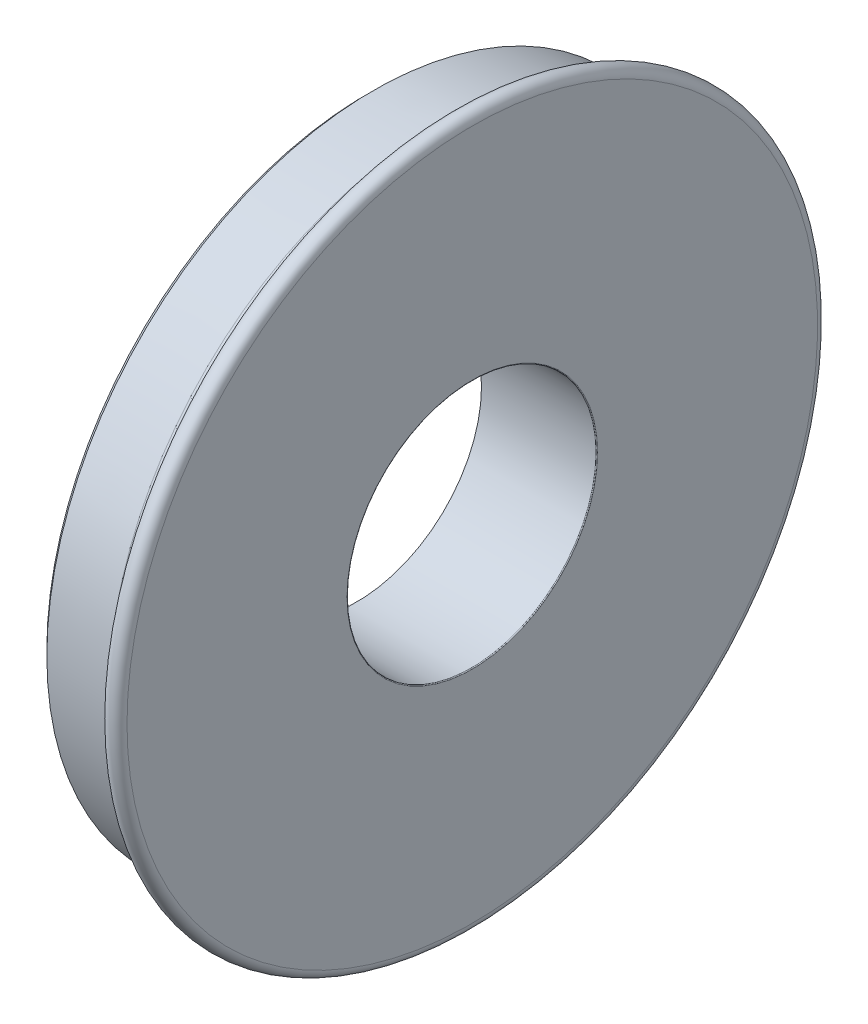
ISO-10303-21;
HEADER;
FILE_DESCRIPTION(('STEP AP214'),'2;1');
FILE_NAME('part.step','',(''),(''),'','','');
FILE_SCHEMA(('AUTOMOTIVE_DESIGN { 1 0 10303 214 1 1 1 1 }'));
ENDSEC;
DATA;
#1=APPLICATION_CONTEXT('core data for automotive mechanical design processes');
#2=APPLICATION_PROTOCOL_DEFINITION('international standard','automotive_design',2000,#1);
#3=PRODUCT_CONTEXT('',#1,'mechanical');
#4=PRODUCT('Part','Part','',(#3));
#5=PRODUCT_RELATED_PRODUCT_CATEGORY('part','',(#4));
#6=PRODUCT_DEFINITION_FORMATION('','',#4);
#7=PRODUCT_DEFINITION_CONTEXT('part definition',#1,'design');
#8=PRODUCT_DEFINITION('design','',#6,#7);
#9=PRODUCT_DEFINITION_SHAPE('','',#8);
#10=(LENGTH_UNIT() NAMED_UNIT(*) SI_UNIT(.MILLI.,.METRE.));
#11=(NAMED_UNIT(*) PLANE_ANGLE_UNIT() SI_UNIT($,.RADIAN.));
#12=(NAMED_UNIT(*) SI_UNIT($,.STERADIAN.) SOLID_ANGLE_UNIT());
#13=UNCERTAINTY_MEASURE_WITH_UNIT(LENGTH_MEASURE(1.E-05),#10,'distance_accuracy_value','');
#14=(GEOMETRIC_REPRESENTATION_CONTEXT(3) GLOBAL_UNCERTAINTY_ASSIGNED_CONTEXT((#13)) GLOBAL_UNIT_ASSIGNED_CONTEXT((#10,
#11,#12)) REPRESENTATION_CONTEXT('',''));
#15=CARTESIAN_POINT('',(0.,0.,0.));
#16=DIRECTION('',(0.,0.,1.));
#17=DIRECTION('',(1.,0.,0.));
#18=AXIS2_PLACEMENT_3D('',#15,#16,#17);
#19=CARTESIAN_POINT('',(0.,49.14,0.));
#20=DIRECTION('',(1.,0.,0.));
#21=DIRECTION('',(0.,0.,-1.));
#22=AXIS2_PLACEMENT_3D('',#19,#20,#21);
#23=PLANE('',#22);
#24=CARTESIAN_POINT('',(0.,0.,0.));
#25=DIRECTION('',(-1.,0.,0.));
#26=DIRECTION('',(0.,0.,1.));
#27=AXIS2_PLACEMENT_3D('',#24,#25,#26);
#28=CIRCLE('',#27,37.8);
#29=CARTESIAN_POINT('',(0.,0.,37.8));
#30=VERTEX_POINT('',#29);
#31=EDGE_CURVE('E10',#30,#30,#28,.T.);
#32=ORIENTED_EDGE('',*,*,#31,.F.);
#33=EDGE_LOOP('',(#32));
#34=FACE_BOUND('',#33,.T.);
#35=CARTESIAN_POINT('',(0.,0.,0.));
#36=DIRECTION('',(-1.,0.,0.));
#37=DIRECTION('',(0.,0.,1.));
#38=AXIS2_PLACEMENT_3D('',#35,#36,#37);
#39=CIRCLE('',#38,49.14);
#40=CARTESIAN_POINT('',(0.,0.,49.14));
#41=VERTEX_POINT('',#40);
#42=EDGE_CURVE('E80',#41,#41,#39,.T.);
#43=ORIENTED_EDGE('',*,*,#42,.T.);
#44=EDGE_LOOP('',(#43));
#45=FACE_BOUND('',#44,.T.);
#46=ADVANCED_FACE('F37',(#34,#45),#23,.F.);
#47=CARTESIAN_POINT('',(-146.164683843443,0.,0.));
#48=DIRECTION('',(-1.,0.,0.));
#49=DIRECTION('',(0.,0.,1.));
#50=AXIS2_PLACEMENT_3D('',#47,#48,#49);
#51=CYLINDRICAL_SURFACE('',#50,37.8);
#52=CARTESIAN_POINT('',(34.75,0.,0.));
#53=DIRECTION('',(-1.,0.,0.));
#54=DIRECTION('',(0.,0.,1.));
#55=AXIS2_PLACEMENT_3D('',#52,#53,#54);
#56=CIRCLE('',#55,37.8);
#57=CARTESIAN_POINT('',(34.75,0.,37.8));
#58=VERTEX_POINT('',#57);
#59=EDGE_CURVE('E43',#58,#58,#56,.T.);
#60=ORIENTED_EDGE('',*,*,#59,.F.);
#61=EDGE_LOOP('',(#60));
#62=FACE_BOUND('',#61,.T.);
#63=ORIENTED_EDGE('',*,*,#31,.T.);
#64=EDGE_LOOP('',(#63));
#65=FACE_BOUND('',#64,.T.);
#66=ADVANCED_FACE('F147',(#62,#65),#51,.F.);
#67=CARTESIAN_POINT('',(34.75,0.,0.));
#68=DIRECTION('',(-1.,0.,0.));
#69=DIRECTION('',(0.,0.,1.));
#70=AXIS2_PLACEMENT_3D('',#67,#68,#69);
#71=TOROIDAL_SURFACE('',#70,38.05,0.25);
#72=CARTESIAN_POINT('',(35.,0.,0.));
#73=DIRECTION('',(-1.,0.,0.));
#74=DIRECTION('',(0.,0.,1.));
#75=AXIS2_PLACEMENT_3D('',#72,#73,#74);
#76=CIRCLE('',#75,38.05);
#77=CARTESIAN_POINT('',(35.,0.,38.05));
#78=VERTEX_POINT('',#77);
#79=EDGE_CURVE('E47',#78,#78,#76,.T.);
#80=ORIENTED_EDGE('',*,*,#79,.F.);
#81=EDGE_LOOP('',(#80));
#82=FACE_BOUND('',#81,.T.);
#83=ORIENTED_EDGE('',*,*,#59,.T.);
#84=EDGE_LOOP('',(#83));
#85=FACE_BOUND('',#84,.T.);
#86=ADVANCED_FACE('F142',(#82,#85),#71,.T.);
#87=CARTESIAN_POINT('',(35.,38.05,0.));
#88=DIRECTION('',(-1.,0.,0.));
#89=DIRECTION('',(0.,0.,1.));
#90=AXIS2_PLACEMENT_3D('',#87,#88,#89);
#91=PLANE('',#90);
#92=CARTESIAN_POINT('',(35.,0.,0.));
#93=DIRECTION('',(-1.,0.,0.));
#94=DIRECTION('',(0.,0.,1.));
#95=AXIS2_PLACEMENT_3D('',#92,#93,#94);
#96=CIRCLE('',#95,104.870611348438);
#97=CARTESIAN_POINT('',(35.,0.,104.870611348438));
#98=VERTEX_POINT('',#97);
#99=EDGE_CURVE('E51',#98,#98,#96,.T.);
#100=ORIENTED_EDGE('',*,*,#99,.F.);
#101=EDGE_LOOP('',(#100));
#102=FACE_BOUND('',#101,.T.);
#103=ORIENTED_EDGE('',*,*,#79,.T.);
#104=EDGE_LOOP('',(#103));
#105=FACE_BOUND('',#104,.T.);
#106=ADVANCED_FACE('F136',(#102,#105),#91,.F.);
#107=CARTESIAN_POINT('',(32.2,0.,0.));
#108=DIRECTION('',(-1.,0.,0.));
#109=DIRECTION('',(0.,0.,1.));
#110=AXIS2_PLACEMENT_3D('',#107,#108,#109);
#111=TOROIDAL_SURFACE('',#110,104.870611348438,2.8);
#112=CARTESIAN_POINT('',(29.4344726463336,0.,0.));
#113=DIRECTION('',(-1.,0.,0.));
#114=DIRECTION('',(0.,0.,1.));
#115=AXIS2_PLACEMENT_3D('',#112,#113,#114);
#116=CIRCLE('',#115,105.308627850551);
#117=CARTESIAN_POINT('',(29.4344726463336,0.,105.308627850551));
#118=VERTEX_POINT('',#117);
#119=EDGE_CURVE('E56',#118,#118,#116,.T.);
#120=ORIENTED_EDGE('',*,*,#119,.F.);
#121=EDGE_LOOP('',(#120));
#122=FACE_BOUND('',#121,.T.);
#123=ORIENTED_EDGE('',*,*,#99,.T.);
#124=EDGE_LOOP('',(#123));
#125=FACE_BOUND('',#124,.T.);
#126=ADVANCED_FACE('F130',(#122,#125),#111,.T.);
#127=CARTESIAN_POINT('',(29.4344726463336,0.,0.));
#128=DIRECTION('',(1.,0.,0.));
#129=DIRECTION('',(0.,0.,-1.));
#130=AXIS2_PLACEMENT_3D('',#127,#128,#129);
#131=CONICAL_SURFACE('',#130,105.308627850551,1.4137166941154);
#132=CARTESIAN_POINT('',(29.2384417029757,0.,0.));
#133=DIRECTION('',(-1.,0.,0.));
#134=DIRECTION('',(0.,0.,1.));
#135=AXIS2_PLACEMENT_3D('',#132,#133,#134);
#136=CIRCLE('',#135,104.070937185001);
#137=CARTESIAN_POINT('',(29.2384417029757,0.,104.070937185001));
#138=VERTEX_POINT('',#137);
#139=EDGE_CURVE('E59',#138,#138,#136,.T.);
#140=ORIENTED_EDGE('',*,*,#139,.F.);
#141=EDGE_LOOP('',(#140));
#142=FACE_BOUND('',#141,.T.);
#143=ORIENTED_EDGE('',*,*,#119,.T.);
#144=EDGE_LOOP('',(#143));
#145=FACE_BOUND('',#144,.T.);
#146=ADVANCED_FACE('F124',(#142,#145),#131,.T.);
#147=CARTESIAN_POINT('',(24.3,0.,0.));
#148=DIRECTION('',(-1.,0.,0.));
#149=DIRECTION('',(0.,0.,1.));
#150=AXIS2_PLACEMENT_3D('',#147,#148,#149);
#151=TOROIDAL_SURFACE('',#150,104.853109510203,5.);
#152=CARTESIAN_POINT('',(24.4744974835125,0.,0.));
#153=DIRECTION('',(-1.,0.,0.));
#154=DIRECTION('',(0.,0.,1.));
#155=AXIS2_PLACEMENT_3D('',#152,#153,#154);
#156=CIRCLE('',#155,99.8561553751071);
#157=CARTESIAN_POINT('',(24.4744974835125,0.,99.8561553751071));
#158=VERTEX_POINT('',#157);
#159=EDGE_CURVE('E62',#158,#158,#156,.T.);
#160=ORIENTED_EDGE('',*,*,#159,.F.);
#161=EDGE_LOOP('',(#160));
#162=FACE_BOUND('',#161,.T.);
#163=ORIENTED_EDGE('',*,*,#139,.T.);
#164=EDGE_LOOP('',(#163));
#165=FACE_BOUND('',#164,.T.);
#166=ADVANCED_FACE('F118',(#162,#165),#151,.F.);
#167=CARTESIAN_POINT('',(24.4744974835125,0.,0.));
#168=DIRECTION('',(1.,0.,0.));
#169=DIRECTION('',(0.,0.,-1.));
#170=AXIS2_PLACEMENT_3D('',#167,#168,#169);
#171=CONICAL_SURFACE('',#170,99.8561553751071,0.0349065850398791);
#172=CARTESIAN_POINT('',(4.95789496801971,0.,0.));
#173=DIRECTION('',(-1.,0.,0.));
#174=DIRECTION('',(0.,0.,1.));
#175=AXIS2_PLACEMENT_3D('',#172,#173,#174);
#176=CIRCLE('',#175,99.1746205974016);
#177=CARTESIAN_POINT('',(4.95789496801971,0.,99.1746205974016));
#178=VERTEX_POINT('',#177);
#179=EDGE_CURVE('E65',#178,#178,#176,.T.);
#180=ORIENTED_EDGE('',*,*,#179,.F.);
#181=EDGE_LOOP('',(#180));
#182=FACE_BOUND('',#181,.T.);
#183=ORIENTED_EDGE('',*,*,#159,.T.);
#184=EDGE_LOOP('',(#183));
#185=FACE_BOUND('',#184,.T.);
#186=ADVANCED_FACE('F112',(#182,#185),#171,.T.);
#187=CARTESIAN_POINT('',(4.95789496801971,0.,0.));
#188=DIRECTION('',(1.,0.,0.));
#189=DIRECTION('',(0.,0.,-1.));
#190=AXIS2_PLACEMENT_3D('',#187,#188,#189);
#191=CONICAL_SURFACE('',#190,99.1746205974016,0.785398163397457);
#192=CARTESIAN_POINT('',(3.3,0.,0.));
#193=DIRECTION('',(-1.,0.,0.));
#194=DIRECTION('',(0.,0.,1.));
#195=AXIS2_PLACEMENT_3D('',#192,#193,#194);
#196=CIRCLE('',#195,97.5167256293819);
#197=CARTESIAN_POINT('',(3.3,0.,97.5167256293819));
#198=VERTEX_POINT('',#197);
#199=EDGE_CURVE('E68',#198,#198,#196,.T.);
#200=ORIENTED_EDGE('',*,*,#199,.F.);
#201=EDGE_LOOP('',(#200));
#202=FACE_BOUND('',#201,.T.);
#203=ORIENTED_EDGE('',*,*,#179,.T.);
#204=EDGE_LOOP('',(#203));
#205=FACE_BOUND('',#204,.T.);
#206=ADVANCED_FACE('F106',(#202,#205),#191,.T.);
#207=CARTESIAN_POINT('',(3.29999999999999,79.4167256293819,0.));
#208=DIRECTION('',(1.,0.,0.));
#209=DIRECTION('',(0.,0.,-1.));
#210=AXIS2_PLACEMENT_3D('',#207,#208,#209);
#211=PLANE('',#210);
#212=CARTESIAN_POINT('',(3.3,0.,0.));
#213=DIRECTION('',(-1.,0.,0.));
#214=DIRECTION('',(0.,0.,1.));
#215=AXIS2_PLACEMENT_3D('',#212,#213,#214);
#216=CIRCLE('',#215,79.4167256293819);
#217=CARTESIAN_POINT('',(3.3,0.,79.4167256293819));
#218=VERTEX_POINT('',#217);
#219=EDGE_CURVE('E71',#218,#218,#216,.T.);
#220=ORIENTED_EDGE('',*,*,#219,.F.);
#221=EDGE_LOOP('',(#220));
#222=FACE_BOUND('',#221,.T.);
#223=ORIENTED_EDGE('',*,*,#199,.T.);
#224=EDGE_LOOP('',(#223));
#225=FACE_BOUND('',#224,.T.);
#226=ADVANCED_FACE('F100',(#222,#225),#211,.F.);
#227=CARTESIAN_POINT('',(-146.164683843443,0.,0.));
#228=DIRECTION('',(-1.,0.,0.));
#229=DIRECTION('',(0.,0.,1.));
#230=AXIS2_PLACEMENT_3D('',#227,#228,#229);
#231=CYLINDRICAL_SURFACE('',#230,79.4167256293819);
#232=CARTESIAN_POINT('',(13.3,0.,0.));
#233=DIRECTION('',(-1.,0.,0.));
#234=DIRECTION('',(0.,0.,1.));
#235=AXIS2_PLACEMENT_3D('',#232,#233,#234);
#236=CIRCLE('',#235,79.4167256293819);
#237=CARTESIAN_POINT('',(13.3,0.,79.4167256293819));
#238=VERTEX_POINT('',#237);
#239=EDGE_CURVE('E74',#238,#238,#236,.T.);
#240=ORIENTED_EDGE('',*,*,#239,.F.);
#241=EDGE_LOOP('',(#240));
#242=FACE_BOUND('',#241,.T.);
#243=ORIENTED_EDGE('',*,*,#219,.T.);
#244=EDGE_LOOP('',(#243));
#245=FACE_BOUND('',#244,.T.);
#246=ADVANCED_FACE('F94',(#242,#245),#231,.F.);
#247=CARTESIAN_POINT('',(13.3,79.4167256293819,0.));
#248=DIRECTION('',(1.,0.,0.));
#249=DIRECTION('',(0.,0.,-1.));
#250=AXIS2_PLACEMENT_3D('',#247,#248,#249);
#251=PLANE('',#250);
#252=CARTESIAN_POINT('',(13.3,0.,0.));
#253=DIRECTION('',(-1.,0.,0.));
#254=DIRECTION('',(0.,0.,1.));
#255=AXIS2_PLACEMENT_3D('',#252,#253,#254);
#256=CIRCLE('',#255,49.14);
#257=CARTESIAN_POINT('',(13.3,0.,49.14));
#258=VERTEX_POINT('',#257);
#259=EDGE_CURVE('E77',#258,#258,#256,.T.);
#260=ORIENTED_EDGE('',*,*,#259,.F.);
#261=EDGE_LOOP('',(#260));
#262=FACE_BOUND('',#261,.T.);
#263=ORIENTED_EDGE('',*,*,#239,.T.);
#264=EDGE_LOOP('',(#263));
#265=FACE_BOUND('',#264,.T.);
#266=ADVANCED_FACE('F88',(#262,#265),#251,.F.);
#267=CARTESIAN_POINT('',(-146.164683843443,0.,0.));
#268=DIRECTION('',(-1.,0.,0.));
#269=DIRECTION('',(0.,0.,1.));
#270=AXIS2_PLACEMENT_3D('',#267,#268,#269);
#271=CYLINDRICAL_SURFACE('',#270,49.14);
#272=ORIENTED_EDGE('',*,*,#42,.F.);
#273=EDGE_LOOP('',(#272));
#274=FACE_BOUND('',#273,.T.);
#275=ORIENTED_EDGE('',*,*,#259,.T.);
#276=EDGE_LOOP('',(#275));
#277=FACE_BOUND('',#276,.T.);
#278=ADVANCED_FACE('F85',(#274,#277),#271,.T.);
#279=CLOSED_SHELL('',(#46,#66,#86,#106,#126,#146,#166,#186,#206,#226,#246,#266,#278));
#280=MANIFOLD_SOLID_BREP('B2',#279);
#281=ADVANCED_BREP_SHAPE_REPRESENTATION('',(#18,#280),#14);
#282=SHAPE_DEFINITION_REPRESENTATION(#9,#281);
ENDSEC;
END-ISO-10303-21;
